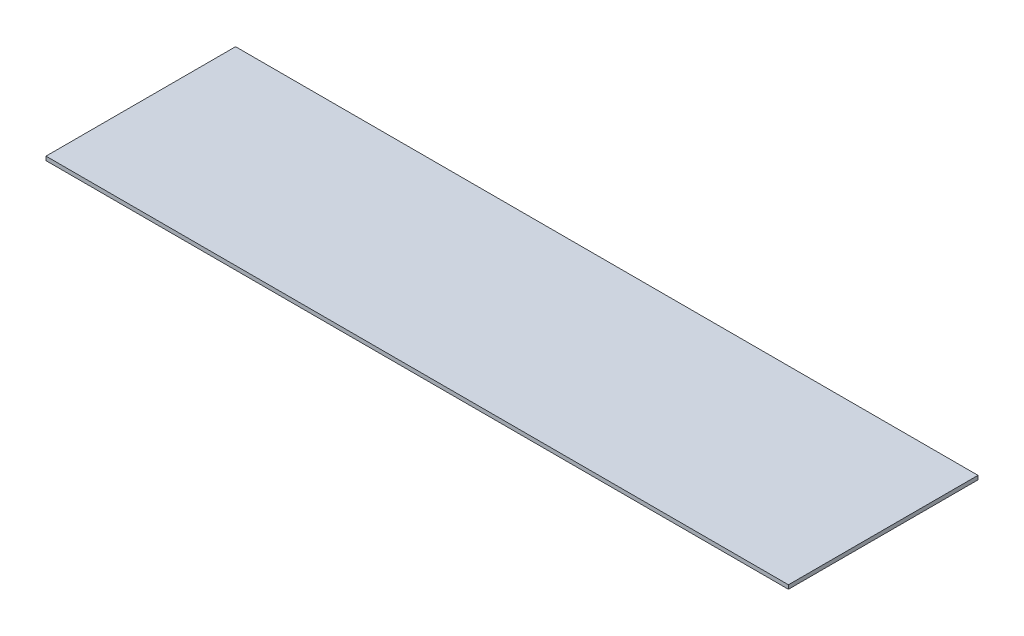
ISO-10303-21;
HEADER;
FILE_DESCRIPTION(('STEP AP214'),'2;1');
FILE_NAME('part.step','',(''),(''),'','','');
FILE_SCHEMA(('AUTOMOTIVE_DESIGN { 1 0 10303 214 1 1 1 1 }'));
ENDSEC;
DATA;
#1=APPLICATION_CONTEXT('core data for automotive mechanical design processes');
#2=APPLICATION_PROTOCOL_DEFINITION('international standard','automotive_design',2000,#1);
#3=PRODUCT_CONTEXT('',#1,'mechanical');
#4=PRODUCT('Part','Part','',(#3));
#5=PRODUCT_RELATED_PRODUCT_CATEGORY('part','',(#4));
#6=PRODUCT_DEFINITION_FORMATION('','',#4);
#7=PRODUCT_DEFINITION_CONTEXT('part definition',#1,'design');
#8=PRODUCT_DEFINITION('design','',#6,#7);
#9=PRODUCT_DEFINITION_SHAPE('','',#8);
#10=(LENGTH_UNIT() NAMED_UNIT(*) SI_UNIT(.MILLI.,.METRE.));
#11=(NAMED_UNIT(*) PLANE_ANGLE_UNIT() SI_UNIT($,.RADIAN.));
#12=(NAMED_UNIT(*) SI_UNIT($,.STERADIAN.) SOLID_ANGLE_UNIT());
#13=UNCERTAINTY_MEASURE_WITH_UNIT(LENGTH_MEASURE(1.E-05),#10,'distance_accuracy_value','');
#14=(GEOMETRIC_REPRESENTATION_CONTEXT(3) GLOBAL_UNCERTAINTY_ASSIGNED_CONTEXT((#13)) GLOBAL_UNIT_ASSIGNED_CONTEXT((#10,
#11,#12)) REPRESENTATION_CONTEXT('',''));
#15=CARTESIAN_POINT('',(0.,0.,0.));
#16=DIRECTION('',(0.,0.,1.));
#17=DIRECTION('',(1.,0.,0.));
#18=AXIS2_PLACEMENT_3D('',#15,#16,#17);
#19=CARTESIAN_POINT('',(0.,3.175,0.));
#20=DIRECTION('',(1.,0.,0.));
#21=DIRECTION('',(0.,0.,-1.));
#22=AXIS2_PLACEMENT_3D('',#19,#20,#21);
#23=PLANE('',#22);
#24=DIRECTION('',(0.,0.,1.));
#25=VECTOR('',#24,1.);
#26=CARTESIAN_POINT('',(0.,0.,0.));
#27=LINE('',#26,#25);
#28=CARTESIAN_POINT('',(0.,0.,-152.4));
#29=VERTEX_POINT('',#28);
#30=CARTESIAN_POINT('',(0.,0.,0.));
#31=VERTEX_POINT('',#30);
#32=EDGE_CURVE('E96',#29,#31,#27,.T.);
#33=ORIENTED_EDGE('',*,*,#32,.T.);
#34=DIRECTION('',(0.,-1.,0.));
#35=VECTOR('',#34,1.);
#36=CARTESIAN_POINT('',(0.,3.175,0.));
#37=LINE('',#36,#35);
#38=CARTESIAN_POINT('',(0.,3.175,0.));
#39=VERTEX_POINT('',#38);
#40=EDGE_CURVE('E11',#39,#31,#37,.T.);
#41=ORIENTED_EDGE('',*,*,#40,.F.);
#42=DIRECTION('',(0.,0.,1.));
#43=VECTOR('',#42,1.);
#44=CARTESIAN_POINT('',(0.,3.175,0.));
#45=LINE('',#44,#43);
#46=CARTESIAN_POINT('',(0.,3.175,-152.4));
#47=VERTEX_POINT('',#46);
#48=EDGE_CURVE('E84',#47,#39,#45,.T.);
#49=ORIENTED_EDGE('',*,*,#48,.F.);
#50=DIRECTION('',(0.,-1.,0.));
#51=VECTOR('',#50,1.);
#52=CARTESIAN_POINT('',(0.,3.175,-152.4));
#53=LINE('',#52,#51);
#54=EDGE_CURVE('E92',#47,#29,#53,.T.);
#55=ORIENTED_EDGE('',*,*,#54,.T.);
#56=EDGE_LOOP('',(#33,#41,#49,#55));
#57=FACE_BOUND('',#56,.T.);
#58=ADVANCED_FACE('F33',(#57),#23,.F.);
#59=CARTESIAN_POINT('',(0.,3.175,0.));
#60=DIRECTION('',(0.,0.,-1.));
#61=DIRECTION('',(-1.,0.,0.));
#62=AXIS2_PLACEMENT_3D('',#59,#60,#61);
#63=PLANE('',#62);
#64=DIRECTION('',(1.,0.,0.));
#65=VECTOR('',#64,1.);
#66=CARTESIAN_POINT('',(0.,0.,0.));
#67=LINE('',#66,#65);
#68=CARTESIAN_POINT('',(596.9,0.,0.));
#69=VERTEX_POINT('',#68);
#70=EDGE_CURVE('E88',#31,#69,#67,.T.);
#71=ORIENTED_EDGE('',*,*,#70,.T.);
#72=DIRECTION('',(0.,-1.,0.));
#73=VECTOR('',#72,1.);
#74=CARTESIAN_POINT('',(596.9,3.175,0.));
#75=LINE('',#74,#73);
#76=CARTESIAN_POINT('',(596.9,3.175,0.));
#77=VERTEX_POINT('',#76);
#78=EDGE_CURVE('E41',#77,#69,#75,.T.);
#79=ORIENTED_EDGE('',*,*,#78,.F.);
#80=DIRECTION('',(1.,0.,0.));
#81=VECTOR('',#80,1.);
#82=CARTESIAN_POINT('',(0.,3.175,0.));
#83=LINE('',#82,#81);
#84=EDGE_CURVE('E79',#39,#77,#83,.T.);
#85=ORIENTED_EDGE('',*,*,#84,.F.);
#86=ORIENTED_EDGE('',*,*,#40,.T.);
#87=EDGE_LOOP('',(#71,#79,#85,#86));
#88=FACE_BOUND('',#87,.T.);
#89=ADVANCED_FACE('F87',(#88),#63,.F.);
#90=CARTESIAN_POINT('',(596.9,3.175,0.));
#91=DIRECTION('',(-1.,0.,0.));
#92=DIRECTION('',(0.,0.,1.));
#93=AXIS2_PLACEMENT_3D('',#90,#91,#92);
#94=PLANE('',#93);
#95=DIRECTION('',(0.,0.,-1.));
#96=VECTOR('',#95,1.);
#97=CARTESIAN_POINT('',(596.9,0.,0.));
#98=LINE('',#97,#96);
#99=CARTESIAN_POINT('',(596.9,0.,-152.4));
#100=VERTEX_POINT('',#99);
#101=EDGE_CURVE('E66',#69,#100,#98,.T.);
#102=ORIENTED_EDGE('',*,*,#101,.T.);
#103=DIRECTION('',(0.,-1.,0.));
#104=VECTOR('',#103,1.);
#105=CARTESIAN_POINT('',(596.9,3.175,-152.4));
#106=LINE('',#105,#104);
#107=CARTESIAN_POINT('',(596.9,3.175,-152.4));
#108=VERTEX_POINT('',#107);
#109=EDGE_CURVE('E89',#108,#100,#106,.T.);
#110=ORIENTED_EDGE('',*,*,#109,.F.);
#111=DIRECTION('',(0.,0.,-1.));
#112=VECTOR('',#111,1.);
#113=CARTESIAN_POINT('',(596.9,3.175,0.));
#114=LINE('',#113,#112);
#115=EDGE_CURVE('E82',#77,#108,#114,.T.);
#116=ORIENTED_EDGE('',*,*,#115,.F.);
#117=ORIENTED_EDGE('',*,*,#78,.T.);
#118=EDGE_LOOP('',(#102,#110,#116,#117));
#119=FACE_BOUND('',#118,.T.);
#120=ADVANCED_FACE('F90',(#119),#94,.F.);
#121=CARTESIAN_POINT('',(0.,3.175,-152.4));
#122=DIRECTION('',(0.,0.,1.));
#123=DIRECTION('',(1.,0.,0.));
#124=AXIS2_PLACEMENT_3D('',#121,#122,#123);
#125=PLANE('',#124);
#126=DIRECTION('',(-1.,0.,0.));
#127=VECTOR('',#126,1.);
#128=CARTESIAN_POINT('',(0.,0.,-152.4));
#129=LINE('',#128,#127);
#130=EDGE_CURVE('E72',#100,#29,#129,.T.);
#131=ORIENTED_EDGE('',*,*,#130,.T.);
#132=ORIENTED_EDGE('',*,*,#54,.F.);
#133=DIRECTION('',(-1.,0.,0.));
#134=VECTOR('',#133,1.);
#135=CARTESIAN_POINT('',(0.,3.175,-152.4));
#136=LINE('',#135,#134);
#137=EDGE_CURVE('E49',#108,#47,#136,.T.);
#138=ORIENTED_EDGE('',*,*,#137,.F.);
#139=ORIENTED_EDGE('',*,*,#109,.T.);
#140=EDGE_LOOP('',(#131,#132,#138,#139));
#141=FACE_BOUND('',#140,.T.);
#142=ADVANCED_FACE('F103',(#141),#125,.F.);
#143=CARTESIAN_POINT('',(0.,3.175,0.));
#144=DIRECTION('',(0.,-1.,0.));
#145=DIRECTION('',(0.,0.,-1.));
#146=AXIS2_PLACEMENT_3D('',#143,#144,#145);
#147=PLANE('',#146);
#148=ORIENTED_EDGE('',*,*,#48,.T.);
#149=ORIENTED_EDGE('',*,*,#84,.T.);
#150=ORIENTED_EDGE('',*,*,#115,.T.);
#151=ORIENTED_EDGE('',*,*,#137,.T.);
#152=EDGE_LOOP('',(#148,#149,#150,#151));
#153=FACE_BOUND('',#152,.T.);
#154=ADVANCED_FACE('F80',(#153),#147,.F.);
#155=CARTESIAN_POINT('',(0.,0.,0.));
#156=DIRECTION('',(0.,-1.,0.));
#157=DIRECTION('',(0.,0.,-1.));
#158=AXIS2_PLACEMENT_3D('',#155,#156,#157);
#159=PLANE('',#158);
#160=ORIENTED_EDGE('',*,*,#32,.F.);
#161=ORIENTED_EDGE('',*,*,#130,.F.);
#162=ORIENTED_EDGE('',*,*,#101,.F.);
#163=ORIENTED_EDGE('',*,*,#70,.F.);
#164=EDGE_LOOP('',(#160,#161,#162,#163));
#165=FACE_BOUND('',#164,.T.);
#166=ADVANCED_FACE('F106',(#165),#159,.T.);
#167=CLOSED_SHELL('',(#58,#89,#120,#142,#154,#166));
#168=MANIFOLD_SOLID_BREP('B2',#167);
#169=ADVANCED_BREP_SHAPE_REPRESENTATION('',(#18,#168),#14);
#170=SHAPE_DEFINITION_REPRESENTATION(#9,#169);
ENDSEC;
END-ISO-10303-21;
